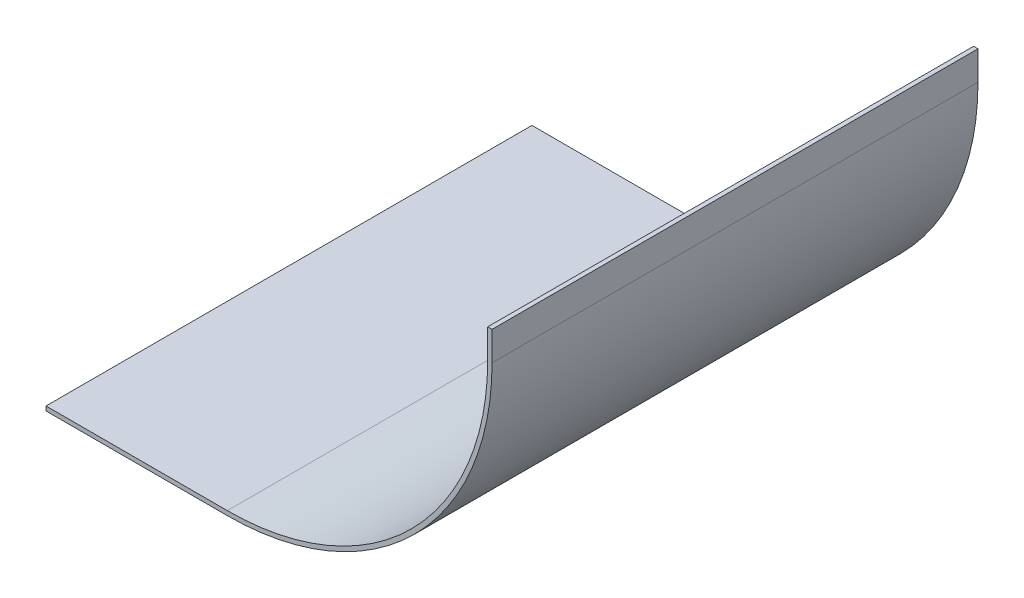
ISO-10303-21;
HEADER;
FILE_DESCRIPTION(('STEP AP214'),'2;1');
FILE_NAME('part.step','',(''),(''),'','','');
FILE_SCHEMA(('AUTOMOTIVE_DESIGN { 1 0 10303 214 1 1 1 1 }'));
ENDSEC;
DATA;
#1=APPLICATION_CONTEXT('core data for automotive mechanical design processes');
#2=APPLICATION_PROTOCOL_DEFINITION('international standard','automotive_design',2000,#1);
#3=PRODUCT_CONTEXT('',#1,'mechanical');
#4=PRODUCT('Part','Part','',(#3));
#5=PRODUCT_RELATED_PRODUCT_CATEGORY('part','',(#4));
#6=PRODUCT_DEFINITION_FORMATION('','',#4);
#7=PRODUCT_DEFINITION_CONTEXT('part definition',#1,'design');
#8=PRODUCT_DEFINITION('design','',#6,#7);
#9=PRODUCT_DEFINITION_SHAPE('','',#8);
#10=(LENGTH_UNIT() NAMED_UNIT(*) SI_UNIT(.MILLI.,.METRE.));
#11=(NAMED_UNIT(*) PLANE_ANGLE_UNIT() SI_UNIT($,.RADIAN.));
#12=(NAMED_UNIT(*) SI_UNIT($,.STERADIAN.) SOLID_ANGLE_UNIT());
#13=UNCERTAINTY_MEASURE_WITH_UNIT(LENGTH_MEASURE(1.E-05),#10,'distance_accuracy_value','');
#14=(GEOMETRIC_REPRESENTATION_CONTEXT(3) GLOBAL_UNCERTAINTY_ASSIGNED_CONTEXT((#13)) GLOBAL_UNIT_ASSIGNED_CONTEXT((#10,
#11,#12)) REPRESENTATION_CONTEXT('',''));
#15=CARTESIAN_POINT('',(0.,0.,0.));
#16=DIRECTION('',(0.,0.,1.));
#17=DIRECTION('',(1.,0.,0.));
#18=AXIS2_PLACEMENT_3D('',#15,#16,#17);
#19=CARTESIAN_POINT('',(1565.,-4410.,-670.));
#20=DIRECTION('',(1.,0.,0.));
#21=DIRECTION('',(0.,1.,0.));
#22=AXIS2_PLACEMENT_3D('',#19,#20,#21);
#23=PLANE('',#22);
#24=DIRECTION('',(0.,1.,0.));
#25=VECTOR('',#24,1.);
#26=CARTESIAN_POINT('',(1565.,-4410.,0.));
#27=LINE('',#26,#25);
#28=CARTESIAN_POINT('',(1565.,-4450.,0.));
#29=VERTEX_POINT('',#28);
#30=CARTESIAN_POINT('',(1565.,-4410.,0.));
#31=VERTEX_POINT('',#30);
#32=EDGE_CURVE('E132',#29,#31,#27,.T.);
#33=ORIENTED_EDGE('',*,*,#32,.F.);
#34=DIRECTION('',(0.,0.,1.));
#35=VECTOR('',#34,1.);
#36=CARTESIAN_POINT('',(1565.,-4450.,-670.));
#37=LINE('',#36,#35);
#38=CARTESIAN_POINT('',(1565.,-4450.,-670.));
#39=VERTEX_POINT('',#38);
#40=EDGE_CURVE('E11',#39,#29,#37,.T.);
#41=ORIENTED_EDGE('',*,*,#40,.F.);
#42=DIRECTION('',(0.,1.,0.));
#43=VECTOR('',#42,1.);
#44=CARTESIAN_POINT('',(1565.,-4410.,-670.));
#45=LINE('',#44,#43);
#46=CARTESIAN_POINT('',(1565.,-4410.,-670.));
#47=VERTEX_POINT('',#46);
#48=EDGE_CURVE('E149',#39,#47,#45,.T.);
#49=ORIENTED_EDGE('',*,*,#48,.T.);
#50=DIRECTION('',(0.,0.,1.));
#51=VECTOR('',#50,1.);
#52=CARTESIAN_POINT('',(1565.,-4410.,-670.));
#53=LINE('',#52,#51);
#54=EDGE_CURVE('E42',#47,#31,#53,.T.);
#55=ORIENTED_EDGE('',*,*,#54,.T.);
#56=EDGE_LOOP('',(#33,#41,#49,#55));
#57=FACE_BOUND('',#56,.T.);
#58=ADVANCED_FACE('F39',(#57),#23,.T.);
#59=CARTESIAN_POINT('',(1200.,-4450.,-670.));
#60=DIRECTION('',(0.,0.,1.));
#61=DIRECTION('',(1.,0.,0.));
#62=AXIS2_PLACEMENT_3D('',#59,#60,#61);
#63=CYLINDRICAL_SURFACE('',#62,365.);
#64=CARTESIAN_POINT('',(1200.,-4450.,0.));
#65=DIRECTION('',(0.,0.,1.));
#66=DIRECTION('',(1.,0.,0.));
#67=AXIS2_PLACEMENT_3D('',#64,#65,#66);
#68=CIRCLE('',#67,365.);
#69=CARTESIAN_POINT('',(1200.,-4815.,0.));
#70=VERTEX_POINT('',#69);
#71=EDGE_CURVE('E147',#70,#29,#68,.T.);
#72=ORIENTED_EDGE('',*,*,#71,.F.);
#73=DIRECTION('',(0.,0.,1.));
#74=VECTOR('',#73,1.);
#75=CARTESIAN_POINT('',(1200.,-4815.,-670.));
#76=LINE('',#75,#74);
#77=CARTESIAN_POINT('',(1200.,-4815.,-670.));
#78=VERTEX_POINT('',#77);
#79=EDGE_CURVE('E48',#78,#70,#76,.T.);
#80=ORIENTED_EDGE('',*,*,#79,.F.);
#81=CARTESIAN_POINT('',(1200.,-4450.,-670.));
#82=DIRECTION('',(0.,0.,1.));
#83=DIRECTION('',(1.,0.,0.));
#84=AXIS2_PLACEMENT_3D('',#81,#82,#83);
#85=CIRCLE('',#84,365.);
#86=EDGE_CURVE('E127',#78,#39,#85,.T.);
#87=ORIENTED_EDGE('',*,*,#86,.T.);
#88=ORIENTED_EDGE('',*,*,#40,.T.);
#89=EDGE_LOOP('',(#72,#80,#87,#88));
#90=FACE_BOUND('',#89,.T.);
#91=ADVANCED_FACE('F167',(#90),#63,.T.);
#92=CARTESIAN_POINT('',(1200.,-4815.,-670.));
#93=DIRECTION('',(0.,-1.,0.));
#94=DIRECTION('',(0.,0.,-1.));
#95=AXIS2_PLACEMENT_3D('',#92,#93,#94);
#96=PLANE('',#95);
#97=DIRECTION('',(1.,0.,0.));
#98=VECTOR('',#97,1.);
#99=CARTESIAN_POINT('',(1200.,-4815.,0.));
#100=LINE('',#99,#98);
#101=CARTESIAN_POINT('',(950.,-4815.,0.));
#102=VERTEX_POINT('',#101);
#103=EDGE_CURVE('E114',#102,#70,#100,.T.);
#104=ORIENTED_EDGE('',*,*,#103,.F.);
#105=DIRECTION('',(0.,0.,1.));
#106=VECTOR('',#105,1.);
#107=CARTESIAN_POINT('',(950.,-4815.,-670.));
#108=LINE('',#107,#106);
#109=CARTESIAN_POINT('',(950.,-4815.,-670.));
#110=VERTEX_POINT('',#109);
#111=EDGE_CURVE('E108',#110,#102,#108,.T.);
#112=ORIENTED_EDGE('',*,*,#111,.F.);
#113=DIRECTION('',(1.,0.,0.));
#114=VECTOR('',#113,1.);
#115=CARTESIAN_POINT('',(1200.,-4815.,-670.));
#116=LINE('',#115,#114);
#117=EDGE_CURVE('E112',#110,#78,#116,.T.);
#118=ORIENTED_EDGE('',*,*,#117,.T.);
#119=ORIENTED_EDGE('',*,*,#79,.T.);
#120=EDGE_LOOP('',(#104,#112,#118,#119));
#121=FACE_BOUND('',#120,.T.);
#122=ADVANCED_FACE('F110',(#121),#96,.T.);
#123=CARTESIAN_POINT('',(950.,-4815.,-670.));
#124=DIRECTION('',(1.,0.,0.));
#125=DIRECTION('',(0.,0.,-1.));
#126=AXIS2_PLACEMENT_3D('',#123,#124,#125);
#127=PLANE('',#126);
#128=DIRECTION('',(0.,1.,0.));
#129=VECTOR('',#128,1.);
#130=CARTESIAN_POINT('',(950.,-4815.,0.));
#131=LINE('',#130,#129);
#132=CARTESIAN_POINT('',(950.,-4809.,0.));
#133=VERTEX_POINT('',#132);
#134=EDGE_CURVE('E144',#102,#133,#131,.T.);
#135=ORIENTED_EDGE('',*,*,#134,.T.);
#136=DIRECTION('',(0.,0.,1.));
#137=VECTOR('',#136,1.);
#138=CARTESIAN_POINT('',(950.,-4809.,-670.));
#139=LINE('',#138,#137);
#140=CARTESIAN_POINT('',(950.,-4809.,-670.));
#141=VERTEX_POINT('',#140);
#142=EDGE_CURVE('E117',#141,#133,#139,.T.);
#143=ORIENTED_EDGE('',*,*,#142,.F.);
#144=DIRECTION('',(0.,1.,0.));
#145=VECTOR('',#144,1.);
#146=CARTESIAN_POINT('',(950.,-4815.,-670.));
#147=LINE('',#146,#145);
#148=EDGE_CURVE('E120',#110,#141,#147,.T.);
#149=ORIENTED_EDGE('',*,*,#148,.F.);
#150=ORIENTED_EDGE('',*,*,#111,.T.);
#151=EDGE_LOOP('',(#135,#143,#149,#150));
#152=FACE_BOUND('',#151,.T.);
#153=ADVANCED_FACE('F121',(#152),#127,.F.);
#154=CARTESIAN_POINT('',(1200.,-4809.,-670.));
#155=DIRECTION('',(0.,-1.,0.));
#156=DIRECTION('',(0.,0.,-1.));
#157=AXIS2_PLACEMENT_3D('',#154,#155,#156);
#158=PLANE('',#157);
#159=DIRECTION('',(1.,0.,0.));
#160=VECTOR('',#159,1.);
#161=CARTESIAN_POINT('',(1200.,-4809.,0.));
#162=LINE('',#161,#160);
#163=CARTESIAN_POINT('',(1200.,-4809.,0.));
#164=VERTEX_POINT('',#163);
#165=EDGE_CURVE('E142',#133,#164,#162,.T.);
#166=ORIENTED_EDGE('',*,*,#165,.T.);
#167=DIRECTION('',(0.,0.,1.));
#168=VECTOR('',#167,1.);
#169=CARTESIAN_POINT('',(1200.,-4809.,-670.));
#170=LINE('',#169,#168);
#171=CARTESIAN_POINT('',(1200.,-4809.,-670.));
#172=VERTEX_POINT('',#171);
#173=EDGE_CURVE('E153',#172,#164,#170,.T.);
#174=ORIENTED_EDGE('',*,*,#173,.F.);
#175=DIRECTION('',(1.,0.,0.));
#176=VECTOR('',#175,1.);
#177=CARTESIAN_POINT('',(1200.,-4809.,-670.));
#178=LINE('',#177,#176);
#179=EDGE_CURVE('E124',#141,#172,#178,.T.);
#180=ORIENTED_EDGE('',*,*,#179,.F.);
#181=ORIENTED_EDGE('',*,*,#142,.T.);
#182=EDGE_LOOP('',(#166,#174,#180,#181));
#183=FACE_BOUND('',#182,.T.);
#184=ADVANCED_FACE('F180',(#183),#158,.F.);
#185=CARTESIAN_POINT('',(1200.,-4450.,-670.));
#186=DIRECTION('',(0.,0.,1.));
#187=DIRECTION('',(1.,0.,0.));
#188=AXIS2_PLACEMENT_3D('',#185,#186,#187);
#189=CYLINDRICAL_SURFACE('',#188,359.);
#190=CARTESIAN_POINT('',(1200.,-4450.,0.));
#191=DIRECTION('',(0.,0.,1.));
#192=DIRECTION('',(1.,0.,0.));
#193=AXIS2_PLACEMENT_3D('',#190,#191,#192);
#194=CIRCLE('',#193,359.);
#195=CARTESIAN_POINT('',(1559.,-4450.,0.));
#196=VERTEX_POINT('',#195);
#197=EDGE_CURVE('E140',#164,#196,#194,.T.);
#198=ORIENTED_EDGE('',*,*,#197,.T.);
#199=DIRECTION('',(0.,0.,1.));
#200=VECTOR('',#199,1.);
#201=CARTESIAN_POINT('',(1559.,-4450.,-670.));
#202=LINE('',#201,#200);
#203=CARTESIAN_POINT('',(1559.,-4450.,-670.));
#204=VERTEX_POINT('',#203);
#205=EDGE_CURVE('E156',#204,#196,#202,.T.);
#206=ORIENTED_EDGE('',*,*,#205,.F.);
#207=CARTESIAN_POINT('',(1200.,-4450.,-670.));
#208=DIRECTION('',(0.,0.,1.));
#209=DIRECTION('',(1.,0.,0.));
#210=AXIS2_PLACEMENT_3D('',#207,#208,#209);
#211=CIRCLE('',#210,359.);
#212=EDGE_CURVE('E258',#172,#204,#211,.T.);
#213=ORIENTED_EDGE('',*,*,#212,.F.);
#214=ORIENTED_EDGE('',*,*,#173,.T.);
#215=EDGE_LOOP('',(#198,#206,#213,#214));
#216=FACE_BOUND('',#215,.T.);
#217=ADVANCED_FACE('F183',(#216),#189,.F.);
#218=CARTESIAN_POINT('',(1559.,-4410.,-670.));
#219=DIRECTION('',(1.,0.,0.));
#220=DIRECTION('',(0.,1.,0.));
#221=AXIS2_PLACEMENT_3D('',#218,#219,#220);
#222=PLANE('',#221);
#223=DIRECTION('',(0.,1.,0.));
#224=VECTOR('',#223,1.);
#225=CARTESIAN_POINT('',(1559.,-4410.,0.));
#226=LINE('',#225,#224);
#227=CARTESIAN_POINT('',(1559.,-4410.,0.));
#228=VERTEX_POINT('',#227);
#229=EDGE_CURVE('E138',#196,#228,#226,.T.);
#230=ORIENTED_EDGE('',*,*,#229,.T.);
#231=DIRECTION('',(0.,0.,1.));
#232=VECTOR('',#231,1.);
#233=CARTESIAN_POINT('',(1559.,-4410.,-670.));
#234=LINE('',#233,#232);
#235=CARTESIAN_POINT('',(1559.,-4410.,-670.));
#236=VERTEX_POINT('',#235);
#237=EDGE_CURVE('E158',#236,#228,#234,.T.);
#238=ORIENTED_EDGE('',*,*,#237,.F.);
#239=DIRECTION('',(0.,1.,0.));
#240=VECTOR('',#239,1.);
#241=CARTESIAN_POINT('',(1559.,-4410.,-670.));
#242=LINE('',#241,#240);
#243=EDGE_CURVE('E259',#204,#236,#242,.T.);
#244=ORIENTED_EDGE('',*,*,#243,.F.);
#245=ORIENTED_EDGE('',*,*,#205,.T.);
#246=EDGE_LOOP('',(#230,#238,#244,#245));
#247=FACE_BOUND('',#246,.T.);
#248=ADVANCED_FACE('F187',(#247),#222,.F.);
#249=CARTESIAN_POINT('',(1559.,-4410.,-670.));
#250=DIRECTION('',(0.,-1.,0.));
#251=DIRECTION('',(0.,0.,-1.));
#252=AXIS2_PLACEMENT_3D('',#249,#250,#251);
#253=PLANE('',#252);
#254=DIRECTION('',(1.,0.,0.));
#255=VECTOR('',#254,1.);
#256=CARTESIAN_POINT('',(1559.,-4410.,0.));
#257=LINE('',#256,#255);
#258=EDGE_CURVE('E135',#228,#31,#257,.T.);
#259=ORIENTED_EDGE('',*,*,#258,.T.);
#260=ORIENTED_EDGE('',*,*,#54,.F.);
#261=DIRECTION('',(1.,0.,0.));
#262=VECTOR('',#261,1.);
#263=CARTESIAN_POINT('',(1559.,-4410.,-670.));
#264=LINE('',#263,#262);
#265=EDGE_CURVE('E95',#236,#47,#264,.T.);
#266=ORIENTED_EDGE('',*,*,#265,.F.);
#267=ORIENTED_EDGE('',*,*,#237,.T.);
#268=EDGE_LOOP('',(#259,#260,#266,#267));
#269=FACE_BOUND('',#268,.T.);
#270=ADVANCED_FACE('F163',(#269),#253,.F.);
#271=CARTESIAN_POINT('',(1200.,-4450.,-670.));
#272=DIRECTION('',(0.,0.,1.));
#273=DIRECTION('',(1.,0.,0.));
#274=AXIS2_PLACEMENT_3D('',#271,#272,#273);
#275=PLANE('',#274);
#276=ORIENTED_EDGE('',*,*,#48,.F.);
#277=ORIENTED_EDGE('',*,*,#86,.F.);
#278=ORIENTED_EDGE('',*,*,#117,.F.);
#279=ORIENTED_EDGE('',*,*,#148,.T.);
#280=ORIENTED_EDGE('',*,*,#179,.T.);
#281=ORIENTED_EDGE('',*,*,#212,.T.);
#282=ORIENTED_EDGE('',*,*,#243,.T.);
#283=ORIENTED_EDGE('',*,*,#265,.T.);
#284=EDGE_LOOP('',(#276,#277,#278,#279,#280,#281,#282,#283));
#285=FACE_BOUND('',#284,.T.);
#286=ADVANCED_FACE('F126',(#285),#275,.F.);
#287=CARTESIAN_POINT('',(1200.,-4450.,0.));
#288=DIRECTION('',(0.,0.,1.));
#289=DIRECTION('',(1.,0.,0.));
#290=AXIS2_PLACEMENT_3D('',#287,#288,#289);
#291=PLANE('',#290);
#292=ORIENTED_EDGE('',*,*,#32,.T.);
#293=ORIENTED_EDGE('',*,*,#258,.F.);
#294=ORIENTED_EDGE('',*,*,#229,.F.);
#295=ORIENTED_EDGE('',*,*,#197,.F.);
#296=ORIENTED_EDGE('',*,*,#165,.F.);
#297=ORIENTED_EDGE('',*,*,#134,.F.);
#298=ORIENTED_EDGE('',*,*,#103,.T.);
#299=ORIENTED_EDGE('',*,*,#71,.T.);
#300=EDGE_LOOP('',(#292,#293,#294,#295,#296,#297,#298,#299));
#301=FACE_BOUND('',#300,.T.);
#302=ADVANCED_FACE('F166',(#301),#291,.T.);
#303=CLOSED_SHELL('',(#58,#91,#122,#153,#184,#217,#248,#270,#286,#302));
#304=MANIFOLD_SOLID_BREP('B2',#303);
#305=ADVANCED_BREP_SHAPE_REPRESENTATION('',(#18,#304),#14);
#306=SHAPE_DEFINITION_REPRESENTATION(#9,#305);
ENDSEC;
END-ISO-10303-21;
